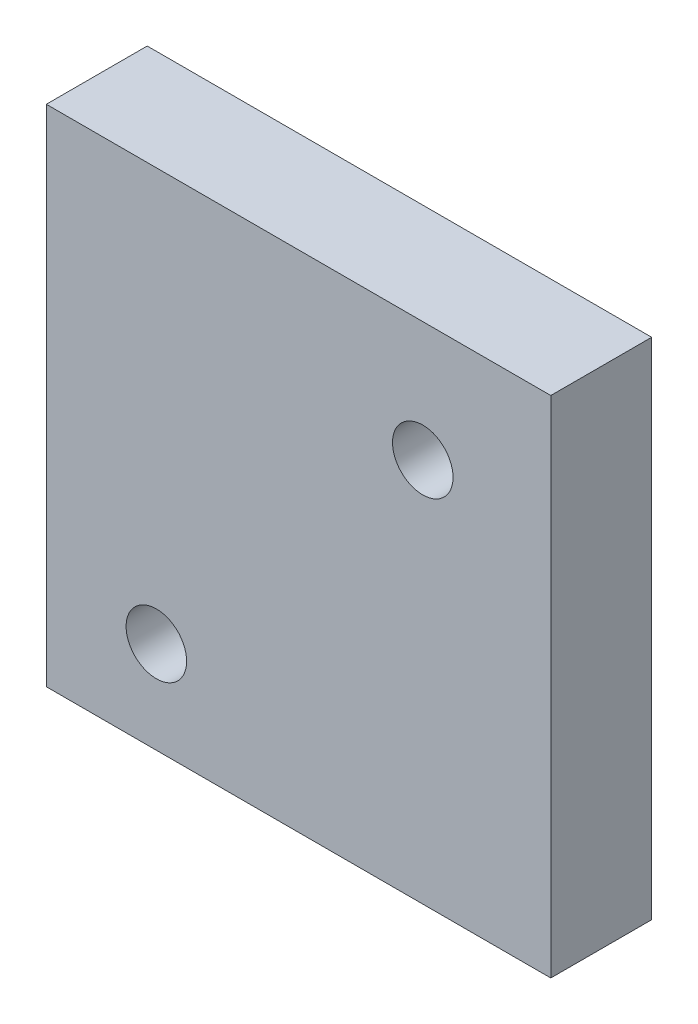
ISO-10303-21;
HEADER;
FILE_DESCRIPTION(('STEP AP214'),'2;1');
FILE_NAME('part.step','',(''),(''),'','','');
FILE_SCHEMA(('AUTOMOTIVE_DESIGN { 1 0 10303 214 1 1 1 1 }'));
ENDSEC;
DATA;
#1=APPLICATION_CONTEXT('core data for automotive mechanical design processes');
#2=APPLICATION_PROTOCOL_DEFINITION('international standard','automotive_design',2000,#1);
#3=PRODUCT_CONTEXT('',#1,'mechanical');
#4=PRODUCT('Part','Part','',(#3));
#5=PRODUCT_RELATED_PRODUCT_CATEGORY('part','',(#4));
#6=PRODUCT_DEFINITION_FORMATION('','',#4);
#7=PRODUCT_DEFINITION_CONTEXT('part definition',#1,'design');
#8=PRODUCT_DEFINITION('design','',#6,#7);
#9=PRODUCT_DEFINITION_SHAPE('','',#8);
#10=(LENGTH_UNIT() NAMED_UNIT(*) SI_UNIT(.MILLI.,.METRE.));
#11=(NAMED_UNIT(*) PLANE_ANGLE_UNIT() SI_UNIT($,.RADIAN.));
#12=(NAMED_UNIT(*) SI_UNIT($,.STERADIAN.) SOLID_ANGLE_UNIT());
#13=UNCERTAINTY_MEASURE_WITH_UNIT(LENGTH_MEASURE(1.E-05),#10,'distance_accuracy_value','');
#14=(GEOMETRIC_REPRESENTATION_CONTEXT(3) GLOBAL_UNCERTAINTY_ASSIGNED_CONTEXT((#13)) GLOBAL_UNIT_ASSIGNED_CONTEXT((#10,
#11,#12)) REPRESENTATION_CONTEXT('',''));
#15=CARTESIAN_POINT('',(0.,0.,0.));
#16=DIRECTION('',(0.,0.,1.));
#17=DIRECTION('',(1.,0.,0.));
#18=AXIS2_PLACEMENT_3D('',#15,#16,#17);
#19=CARTESIAN_POINT('',(0.,0.,20.));
#20=DIRECTION('',(1.,0.,0.));
#21=DIRECTION('',(0.,0.,-1.));
#22=AXIS2_PLACEMENT_3D('',#19,#20,#21);
#23=PLANE('',#22);
#24=DIRECTION('',(0.,-1.,0.));
#25=VECTOR('',#24,1.);
#26=CARTESIAN_POINT('',(0.,0.,0.));
#27=LINE('',#26,#25);
#28=CARTESIAN_POINT('',(0.,100.,0.));
#29=VERTEX_POINT('',#28);
#30=CARTESIAN_POINT('',(0.,0.,0.));
#31=VERTEX_POINT('',#30);
#32=EDGE_CURVE('E107',#29,#31,#27,.T.);
#33=ORIENTED_EDGE('',*,*,#32,.T.);
#34=DIRECTION('',(0.,0.,-1.));
#35=VECTOR('',#34,1.);
#36=CARTESIAN_POINT('',(0.,0.,20.));
#37=LINE('',#36,#35);
#38=CARTESIAN_POINT('',(0.,0.,20.));
#39=VERTEX_POINT('',#38);
#40=EDGE_CURVE('E11',#39,#31,#37,.T.);
#41=ORIENTED_EDGE('',*,*,#40,.F.);
#42=DIRECTION('',(0.,-1.,0.));
#43=VECTOR('',#42,1.);
#44=CARTESIAN_POINT('',(0.,0.,20.));
#45=LINE('',#44,#43);
#46=CARTESIAN_POINT('',(0.,100.,20.));
#47=VERTEX_POINT('',#46);
#48=EDGE_CURVE('E91',#47,#39,#45,.T.);
#49=ORIENTED_EDGE('',*,*,#48,.F.);
#50=DIRECTION('',(0.,0.,-1.));
#51=VECTOR('',#50,1.);
#52=CARTESIAN_POINT('',(0.,100.,20.));
#53=LINE('',#52,#51);
#54=EDGE_CURVE('E103',#47,#29,#53,.T.);
#55=ORIENTED_EDGE('',*,*,#54,.T.);
#56=EDGE_LOOP('',(#33,#41,#49,#55));
#57=FACE_BOUND('',#56,.T.);
#58=ADVANCED_FACE('F39',(#57),#23,.F.);
#59=CARTESIAN_POINT('',(0.,0.,20.));
#60=DIRECTION('',(0.,1.,0.));
#61=DIRECTION('',(0.,0.,1.));
#62=AXIS2_PLACEMENT_3D('',#59,#60,#61);
#63=PLANE('',#62);
#64=DIRECTION('',(1.,0.,0.));
#65=VECTOR('',#64,1.);
#66=CARTESIAN_POINT('',(0.,0.,0.));
#67=LINE('',#66,#65);
#68=CARTESIAN_POINT('',(100.,0.,0.));
#69=VERTEX_POINT('',#68);
#70=EDGE_CURVE('E96',#31,#69,#67,.T.);
#71=ORIENTED_EDGE('',*,*,#70,.T.);
#72=DIRECTION('',(0.,0.,-1.));
#73=VECTOR('',#72,1.);
#74=CARTESIAN_POINT('',(100.,0.,20.));
#75=LINE('',#74,#73);
#76=CARTESIAN_POINT('',(100.,0.,20.));
#77=VERTEX_POINT('',#76);
#78=EDGE_CURVE('E48',#77,#69,#75,.T.);
#79=ORIENTED_EDGE('',*,*,#78,.F.);
#80=DIRECTION('',(1.,0.,0.));
#81=VECTOR('',#80,1.);
#82=CARTESIAN_POINT('',(0.,0.,20.));
#83=LINE('',#82,#81);
#84=EDGE_CURVE('E86',#39,#77,#83,.T.);
#85=ORIENTED_EDGE('',*,*,#84,.F.);
#86=ORIENTED_EDGE('',*,*,#40,.T.);
#87=EDGE_LOOP('',(#71,#79,#85,#86));
#88=FACE_BOUND('',#87,.T.);
#89=ADVANCED_FACE('F95',(#88),#63,.F.);
#90=CARTESIAN_POINT('',(100.,0.,20.));
#91=DIRECTION('',(-1.,0.,0.));
#92=DIRECTION('',(0.,0.,1.));
#93=AXIS2_PLACEMENT_3D('',#90,#91,#92);
#94=PLANE('',#93);
#95=DIRECTION('',(0.,1.,0.));
#96=VECTOR('',#95,1.);
#97=CARTESIAN_POINT('',(100.,0.,0.));
#98=LINE('',#97,#96);
#99=CARTESIAN_POINT('',(100.,100.,0.));
#100=VERTEX_POINT('',#99);
#101=EDGE_CURVE('E73',#69,#100,#98,.T.);
#102=ORIENTED_EDGE('',*,*,#101,.T.);
#103=DIRECTION('',(0.,0.,-1.));
#104=VECTOR('',#103,1.);
#105=CARTESIAN_POINT('',(100.,100.,20.));
#106=LINE('',#105,#104);
#107=CARTESIAN_POINT('',(100.,100.,20.));
#108=VERTEX_POINT('',#107);
#109=EDGE_CURVE('E98',#108,#100,#106,.T.);
#110=ORIENTED_EDGE('',*,*,#109,.F.);
#111=DIRECTION('',(0.,1.,0.));
#112=VECTOR('',#111,1.);
#113=CARTESIAN_POINT('',(100.,0.,20.));
#114=LINE('',#113,#112);
#115=EDGE_CURVE('E89',#77,#108,#114,.T.);
#116=ORIENTED_EDGE('',*,*,#115,.F.);
#117=ORIENTED_EDGE('',*,*,#78,.T.);
#118=EDGE_LOOP('',(#102,#110,#116,#117));
#119=FACE_BOUND('',#118,.T.);
#120=ADVANCED_FACE('F99',(#119),#94,.F.);
#121=CARTESIAN_POINT('',(0.,100.,20.));
#122=DIRECTION('',(0.,-1.,0.));
#123=DIRECTION('',(0.,0.,-1.));
#124=AXIS2_PLACEMENT_3D('',#121,#122,#123);
#125=PLANE('',#124);
#126=DIRECTION('',(-1.,0.,0.));
#127=VECTOR('',#126,1.);
#128=CARTESIAN_POINT('',(0.,100.,0.));
#129=LINE('',#128,#127);
#130=EDGE_CURVE('E79',#100,#29,#129,.T.);
#131=ORIENTED_EDGE('',*,*,#130,.T.);
#132=ORIENTED_EDGE('',*,*,#54,.F.);
#133=DIRECTION('',(-1.,0.,0.));
#134=VECTOR('',#133,1.);
#135=CARTESIAN_POINT('',(0.,100.,20.));
#136=LINE('',#135,#134);
#137=EDGE_CURVE('E56',#108,#47,#136,.T.);
#138=ORIENTED_EDGE('',*,*,#137,.F.);
#139=ORIENTED_EDGE('',*,*,#109,.T.);
#140=EDGE_LOOP('',(#131,#132,#138,#139));
#141=FACE_BOUND('',#140,.T.);
#142=ADVANCED_FACE('F121',(#141),#125,.F.);
#143=CARTESIAN_POINT('',(0.,0.,20.));
#144=DIRECTION('',(0.,0.,-1.));
#145=DIRECTION('',(-1.,0.,0.));
#146=AXIS2_PLACEMENT_3D('',#143,#144,#145);
#147=PLANE('',#146);
#148=CARTESIAN_POINT('',(74.6236976293062,76.2463531121398,20.));
#149=DIRECTION('',(0.,0.,1.));
#150=DIRECTION('',(1.,0.,0.));
#151=AXIS2_PLACEMENT_3D('',#148,#149,#150);
#152=CIRCLE('',#151,6.00000000000001);
#153=CARTESIAN_POINT('',(80.6236976293062,76.2463531121398,20.));
#154=VERTEX_POINT('',#153);
#155=EDGE_CURVE('E139',#154,#154,#152,.T.);
#156=ORIENTED_EDGE('',*,*,#155,.F.);
#157=EDGE_LOOP('',(#156));
#158=FACE_BOUND('',#157,.T.);
#159=CARTESIAN_POINT('',(21.812069899056,18.2761042327684,20.));
#160=DIRECTION('',(0.,0.,1.));
#161=DIRECTION('',(1.,0.,0.));
#162=AXIS2_PLACEMENT_3D('',#159,#160,#161);
#163=CIRCLE('',#162,6.);
#164=CARTESIAN_POINT('',(27.812069899056,18.2761042327684,20.));
#165=VERTEX_POINT('',#164);
#166=EDGE_CURVE('E131',#165,#165,#163,.T.);
#167=ORIENTED_EDGE('',*,*,#166,.F.);
#168=EDGE_LOOP('',(#167));
#169=FACE_BOUND('',#168,.T.);
#170=ORIENTED_EDGE('',*,*,#48,.T.);
#171=ORIENTED_EDGE('',*,*,#84,.T.);
#172=ORIENTED_EDGE('',*,*,#115,.T.);
#173=ORIENTED_EDGE('',*,*,#137,.T.);
#174=EDGE_LOOP('',(#170,#171,#172,#173));
#175=FACE_BOUND('',#174,.T.);
#176=ADVANCED_FACE('F87',(#158,#169,#175),#147,.F.);
#177=CARTESIAN_POINT('',(0.,0.,0.));
#178=DIRECTION('',(0.,0.,-1.));
#179=DIRECTION('',(-1.,0.,0.));
#180=AXIS2_PLACEMENT_3D('',#177,#178,#179);
#181=PLANE('',#180);
#182=CARTESIAN_POINT('',(74.6236976293062,76.2463531121398,0.));
#183=DIRECTION('',(0.,0.,1.));
#184=DIRECTION('',(1.,0.,0.));
#185=AXIS2_PLACEMENT_3D('',#182,#183,#184);
#186=CIRCLE('',#185,5.99999999999999);
#187=CARTESIAN_POINT('',(80.6236976293062,76.2463531121398,0.));
#188=VERTEX_POINT('',#187);
#189=EDGE_CURVE('E135',#188,#188,#186,.T.);
#190=ORIENTED_EDGE('',*,*,#189,.T.);
#191=EDGE_LOOP('',(#190));
#192=FACE_BOUND('',#191,.T.);
#193=CARTESIAN_POINT('',(21.812069899056,18.2761042327684,0.));
#194=DIRECTION('',(0.,0.,1.));
#195=DIRECTION('',(1.,0.,0.));
#196=AXIS2_PLACEMENT_3D('',#193,#194,#195);
#197=CIRCLE('',#196,6.);
#198=CARTESIAN_POINT('',(27.812069899056,18.2761042327684,0.));
#199=VERTEX_POINT('',#198);
#200=EDGE_CURVE('E111',#199,#199,#197,.T.);
#201=ORIENTED_EDGE('',*,*,#200,.T.);
#202=EDGE_LOOP('',(#201));
#203=FACE_BOUND('',#202,.T.);
#204=ORIENTED_EDGE('',*,*,#32,.F.);
#205=ORIENTED_EDGE('',*,*,#130,.F.);
#206=ORIENTED_EDGE('',*,*,#101,.F.);
#207=ORIENTED_EDGE('',*,*,#70,.F.);
#208=EDGE_LOOP('',(#204,#205,#206,#207));
#209=FACE_BOUND('',#208,.T.);
#210=ADVANCED_FACE('F124',(#192,#203,#209),#181,.T.);
#211=CARTESIAN_POINT('',(21.812069899056,18.2761042327684,20.));
#212=DIRECTION('',(0.,0.,1.));
#213=DIRECTION('',(1.,0.,0.));
#214=AXIS2_PLACEMENT_3D('',#211,#212,#213);
#215=CYLINDRICAL_SURFACE('',#214,6.);
#216=ORIENTED_EDGE('',*,*,#200,.F.);
#217=EDGE_LOOP('',(#216));
#218=FACE_BOUND('',#217,.T.);
#219=ORIENTED_EDGE('',*,*,#166,.T.);
#220=EDGE_LOOP('',(#219));
#221=FACE_BOUND('',#220,.T.);
#222=ADVANCED_FACE('F151',(#218,#221),#215,.F.);
#223=CARTESIAN_POINT('',(74.6236976293062,76.2463531121398,20.));
#224=DIRECTION('',(0.,0.,1.));
#225=DIRECTION('',(1.,0.,0.));
#226=AXIS2_PLACEMENT_3D('',#223,#224,#225);
#227=CYLINDRICAL_SURFACE('',#226,6.);
#228=ORIENTED_EDGE('',*,*,#189,.F.);
#229=EDGE_LOOP('',(#228));
#230=FACE_BOUND('',#229,.T.);
#231=ORIENTED_EDGE('',*,*,#155,.T.);
#232=EDGE_LOOP('',(#231));
#233=FACE_BOUND('',#232,.T.);
#234=ADVANCED_FACE('F144',(#230,#233),#227,.F.);
#235=CLOSED_SHELL('',(#58,#89,#120,#142,#176,#210,#222,#234));
#236=MANIFOLD_SOLID_BREP('B2',#235);
#237=ADVANCED_BREP_SHAPE_REPRESENTATION('',(#18,#236),#14);
#238=SHAPE_DEFINITION_REPRESENTATION(#9,#237);
ENDSEC;
END-ISO-10303-21;
